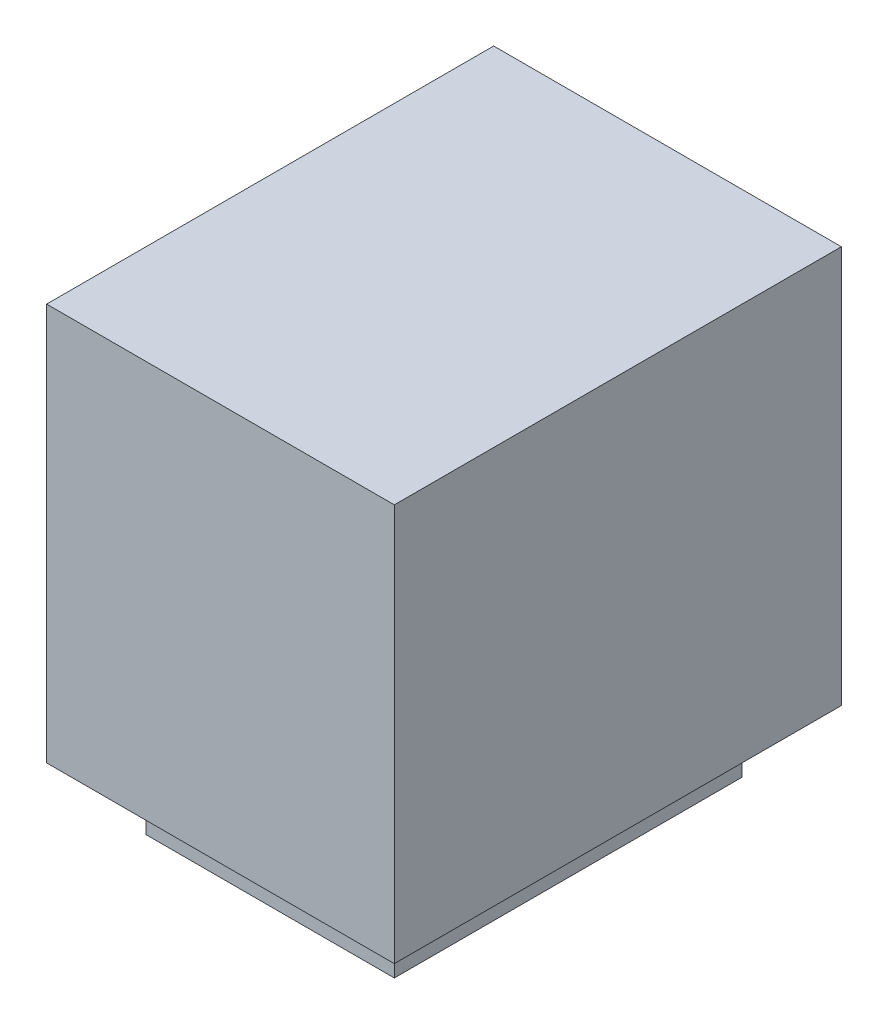
ISO-10303-21;
HEADER;
FILE_DESCRIPTION(('STEP AP214'),'2;1');
FILE_NAME('part.step','',(''),(''),'','','');
FILE_SCHEMA(('AUTOMOTIVE_DESIGN { 1 0 10303 214 1 1 1 1 }'));
ENDSEC;
DATA;
#1=APPLICATION_CONTEXT('core data for automotive mechanical design processes');
#2=APPLICATION_PROTOCOL_DEFINITION('international standard','automotive_design',2000,#1);
#3=PRODUCT_CONTEXT('',#1,'mechanical');
#4=PRODUCT('Part','Part','',(#3));
#5=PRODUCT_RELATED_PRODUCT_CATEGORY('part','',(#4));
#6=PRODUCT_DEFINITION_FORMATION('','',#4);
#7=PRODUCT_DEFINITION_CONTEXT('part definition',#1,'design');
#8=PRODUCT_DEFINITION('design','',#6,#7);
#9=PRODUCT_DEFINITION_SHAPE('','',#8);
#10=(LENGTH_UNIT() NAMED_UNIT(*) SI_UNIT(.MILLI.,.METRE.));
#11=(NAMED_UNIT(*) PLANE_ANGLE_UNIT() SI_UNIT($,.RADIAN.));
#12=(NAMED_UNIT(*) SI_UNIT($,.STERADIAN.) SOLID_ANGLE_UNIT());
#13=UNCERTAINTY_MEASURE_WITH_UNIT(LENGTH_MEASURE(1.E-05),#10,'distance_accuracy_value','');
#14=(GEOMETRIC_REPRESENTATION_CONTEXT(3) GLOBAL_UNCERTAINTY_ASSIGNED_CONTEXT((#13)) GLOBAL_UNIT_ASSIGNED_CONTEXT((#10,
#11,#12)) REPRESENTATION_CONTEXT('',''));
#15=CARTESIAN_POINT('',(0.,0.,0.));
#16=DIRECTION('',(0.,0.,1.));
#17=DIRECTION('',(1.,0.,0.));
#18=AXIS2_PLACEMENT_3D('',#15,#16,#17);
#19=CARTESIAN_POINT('',(700.,1600.,-900.));
#20=DIRECTION('',(-1.,0.,0.));
#21=DIRECTION('',(0.,0.,1.));
#22=AXIS2_PLACEMENT_3D('',#19,#20,#21);
#23=PLANE('',#22);
#24=DIRECTION('',(0.,0.,-1.));
#25=VECTOR('',#24,1.);
#26=CARTESIAN_POINT('',(700.,0.,-900.));
#27=LINE('',#26,#25);
#28=CARTESIAN_POINT('',(700.,0.,900.));
#29=VERTEX_POINT('',#28);
#30=CARTESIAN_POINT('',(700.,0.,-900.));
#31=VERTEX_POINT('',#30);
#32=EDGE_CURVE('E241',#29,#31,#27,.T.);
#33=ORIENTED_EDGE('',*,*,#32,.T.);
#34=DIRECTION('',(0.,-1.,0.));
#35=VECTOR('',#34,1.);
#36=CARTESIAN_POINT('',(700.,1600.,-900.));
#37=LINE('',#36,#35);
#38=CARTESIAN_POINT('',(700.,1600.,-900.));
#39=VERTEX_POINT('',#38);
#40=EDGE_CURVE('E11',#39,#31,#37,.T.);
#41=ORIENTED_EDGE('',*,*,#40,.F.);
#42=DIRECTION('',(0.,0.,-1.));
#43=VECTOR('',#42,1.);
#44=CARTESIAN_POINT('',(700.,1600.,-900.));
#45=LINE('',#44,#43);
#46=CARTESIAN_POINT('',(700.,1600.,900.));
#47=VERTEX_POINT('',#46);
#48=EDGE_CURVE('E247',#47,#39,#45,.T.);
#49=ORIENTED_EDGE('',*,*,#48,.F.);
#50=DIRECTION('',(0.,-1.,0.));
#51=VECTOR('',#50,1.);
#52=CARTESIAN_POINT('',(700.,1600.,900.));
#53=LINE('',#52,#51);
#54=EDGE_CURVE('E257',#47,#29,#53,.T.);
#55=ORIENTED_EDGE('',*,*,#54,.T.);
#56=EDGE_LOOP('',(#33,#41,#49,#55));
#57=FACE_BOUND('',#56,.T.);
#58=ADVANCED_FACE('F34',(#57),#23,.F.);
#59=CARTESIAN_POINT('',(-700.,1600.,-900.));
#60=DIRECTION('',(0.,0.,1.));
#61=DIRECTION('',(1.,0.,0.));
#62=AXIS2_PLACEMENT_3D('',#59,#60,#61);
#63=PLANE('',#62);
#64=DIRECTION('',(-1.,0.,0.));
#65=VECTOR('',#64,1.);
#66=CARTESIAN_POINT('',(-700.,0.,-900.));
#67=LINE('',#66,#65);
#68=CARTESIAN_POINT('',(-700.,0.,-900.));
#69=VERTEX_POINT('',#68);
#70=EDGE_CURVE('E260',#31,#69,#67,.T.);
#71=ORIENTED_EDGE('',*,*,#70,.T.);
#72=DIRECTION('',(0.,-1.,0.));
#73=VECTOR('',#72,1.);
#74=CARTESIAN_POINT('',(-700.,1600.,-900.));
#75=LINE('',#74,#73);
#76=CARTESIAN_POINT('',(-700.,1600.,-900.));
#77=VERTEX_POINT('',#76);
#78=EDGE_CURVE('E41',#77,#69,#75,.T.);
#79=ORIENTED_EDGE('',*,*,#78,.F.);
#80=DIRECTION('',(-1.,0.,0.));
#81=VECTOR('',#80,1.);
#82=CARTESIAN_POINT('',(-700.,1600.,-900.));
#83=LINE('',#82,#81);
#84=EDGE_CURVE('E250',#39,#77,#83,.T.);
#85=ORIENTED_EDGE('',*,*,#84,.F.);
#86=ORIENTED_EDGE('',*,*,#40,.T.);
#87=EDGE_LOOP('',(#71,#79,#85,#86));
#88=FACE_BOUND('',#87,.T.);
#89=ADVANCED_FACE('F290',(#88),#63,.F.);
#90=CARTESIAN_POINT('',(-700.,1600.,-900.));
#91=DIRECTION('',(1.,0.,0.));
#92=DIRECTION('',(0.,0.,-1.));
#93=AXIS2_PLACEMENT_3D('',#90,#91,#92);
#94=PLANE('',#93);
#95=DIRECTION('',(0.,0.,1.));
#96=VECTOR('',#95,1.);
#97=CARTESIAN_POINT('',(-700.,0.,-900.));
#98=LINE('',#97,#96);
#99=CARTESIAN_POINT('',(-700.,0.,900.));
#100=VERTEX_POINT('',#99);
#101=EDGE_CURVE('E262',#69,#100,#98,.T.);
#102=ORIENTED_EDGE('',*,*,#101,.T.);
#103=DIRECTION('',(0.,-1.,0.));
#104=VECTOR('',#103,1.);
#105=CARTESIAN_POINT('',(-700.,1600.,900.));
#106=LINE('',#105,#104);
#107=CARTESIAN_POINT('',(-700.,1600.,900.));
#108=VERTEX_POINT('',#107);
#109=EDGE_CURVE('E267',#108,#100,#106,.T.);
#110=ORIENTED_EDGE('',*,*,#109,.F.);
#111=DIRECTION('',(0.,0.,1.));
#112=VECTOR('',#111,1.);
#113=CARTESIAN_POINT('',(-700.,1600.,-900.));
#114=LINE('',#113,#112);
#115=EDGE_CURVE('E253',#77,#108,#114,.T.);
#116=ORIENTED_EDGE('',*,*,#115,.F.);
#117=ORIENTED_EDGE('',*,*,#78,.T.);
#118=EDGE_LOOP('',(#102,#110,#116,#117));
#119=FACE_BOUND('',#118,.T.);
#120=ADVANCED_FACE('F274',(#119),#94,.F.);
#121=CARTESIAN_POINT('',(-700.,1600.,900.));
#122=DIRECTION('',(0.,0.,-1.));
#123=DIRECTION('',(-1.,0.,0.));
#124=AXIS2_PLACEMENT_3D('',#121,#122,#123);
#125=PLANE('',#124);
#126=DIRECTION('',(1.,0.,0.));
#127=VECTOR('',#126,1.);
#128=CARTESIAN_POINT('',(-700.,0.,900.));
#129=LINE('',#128,#127);
#130=EDGE_CURVE('E251',#100,#29,#129,.T.);
#131=ORIENTED_EDGE('',*,*,#130,.T.);
#132=ORIENTED_EDGE('',*,*,#54,.F.);
#133=DIRECTION('',(1.,0.,0.));
#134=VECTOR('',#133,1.);
#135=CARTESIAN_POINT('',(-700.,1600.,900.));
#136=LINE('',#135,#134);
#137=EDGE_CURVE('E255',#108,#47,#136,.T.);
#138=ORIENTED_EDGE('',*,*,#137,.F.);
#139=ORIENTED_EDGE('',*,*,#109,.T.);
#140=EDGE_LOOP('',(#131,#132,#138,#139));
#141=FACE_BOUND('',#140,.T.);
#142=ADVANCED_FACE('F283',(#141),#125,.F.);
#143=CARTESIAN_POINT('',(0.,1600.,0.));
#144=DIRECTION('',(0.,1.,0.));
#145=DIRECTION('',(0.,0.,1.));
#146=AXIS2_PLACEMENT_3D('',#143,#144,#145);
#147=PLANE('',#146);
#148=ORIENTED_EDGE('',*,*,#48,.T.);
#149=ORIENTED_EDGE('',*,*,#84,.T.);
#150=ORIENTED_EDGE('',*,*,#115,.T.);
#151=ORIENTED_EDGE('',*,*,#137,.T.);
#152=EDGE_LOOP('',(#148,#149,#150,#151));
#153=FACE_BOUND('',#152,.T.);
#154=ADVANCED_FACE('F289',(#153),#147,.T.);
#155=CARTESIAN_POINT('',(0.,0.,0.));
#156=DIRECTION('',(0.,1.,0.));
#157=DIRECTION('',(0.,0.,1.));
#158=AXIS2_PLACEMENT_3D('',#155,#156,#157);
#159=PLANE('',#158);
#160=DIRECTION('',(1.,0.,0.));
#161=VECTOR('',#160,1.);
#162=CARTESIAN_POINT('',(-500.,0.,700.));
#163=LINE('',#162,#161);
#164=CARTESIAN_POINT('',(-500.,0.,700.));
#165=VERTEX_POINT('',#164);
#166=CARTESIAN_POINT('',(500.,0.,700.));
#167=VERTEX_POINT('',#166);
#168=EDGE_CURVE('E218',#165,#167,#163,.T.);
#169=ORIENTED_EDGE('',*,*,#168,.T.);
#170=DIRECTION('',(0.,0.,-1.));
#171=VECTOR('',#170,1.);
#172=CARTESIAN_POINT('',(500.,0.,-700.));
#173=LINE('',#172,#171);
#174=CARTESIAN_POINT('',(500.,0.,-700.));
#175=VERTEX_POINT('',#174);
#176=EDGE_CURVE('E208',#167,#175,#173,.T.);
#177=ORIENTED_EDGE('',*,*,#176,.T.);
#178=DIRECTION('',(-1.,0.,0.));
#179=VECTOR('',#178,1.);
#180=CARTESIAN_POINT('',(-500.,0.,-700.));
#181=LINE('',#180,#179);
#182=CARTESIAN_POINT('',(-500.,0.,-700.));
#183=VERTEX_POINT('',#182);
#184=EDGE_CURVE('E230',#175,#183,#181,.T.);
#185=ORIENTED_EDGE('',*,*,#184,.T.);
#186=DIRECTION('',(0.,0.,1.));
#187=VECTOR('',#186,1.);
#188=CARTESIAN_POINT('',(-500.,0.,-700.));
#189=LINE('',#188,#187);
#190=EDGE_CURVE('E233',#183,#165,#189,.T.);
#191=ORIENTED_EDGE('',*,*,#190,.T.);
#192=EDGE_LOOP('',(#169,#177,#185,#191));
#193=FACE_BOUND('',#192,.T.);
#194=ORIENTED_EDGE('',*,*,#32,.F.);
#195=ORIENTED_EDGE('',*,*,#130,.F.);
#196=ORIENTED_EDGE('',*,*,#101,.F.);
#197=ORIENTED_EDGE('',*,*,#70,.F.);
#198=EDGE_LOOP('',(#194,#195,#196,#197));
#199=FACE_BOUND('',#198,.T.);
#200=ADVANCED_FACE('F280',(#193,#199),#159,.F.);
#201=CARTESIAN_POINT('',(500.,-250.,-700.));
#202=DIRECTION('',(1.,0.,0.));
#203=DIRECTION('',(0.,0.,-1.));
#204=AXIS2_PLACEMENT_3D('',#201,#202,#203);
#205=PLANE('',#204);
#206=ORIENTED_EDGE('',*,*,#176,.F.);
#207=DIRECTION('',(0.,1.,0.));
#208=VECTOR('',#207,1.);
#209=CARTESIAN_POINT('',(500.,-250.,700.));
#210=LINE('',#209,#208);
#211=CARTESIAN_POINT('',(500.,-250.,700.));
#212=VERTEX_POINT('',#211);
#213=EDGE_CURVE('E238',#212,#167,#210,.T.);
#214=ORIENTED_EDGE('',*,*,#213,.F.);
#215=DIRECTION('',(0.,0.,-1.));
#216=VECTOR('',#215,1.);
#217=CARTESIAN_POINT('',(500.,-250.,-700.));
#218=LINE('',#217,#216);
#219=CARTESIAN_POINT('',(500.,-250.,-700.));
#220=VERTEX_POINT('',#219);
#221=EDGE_CURVE('E214',#212,#220,#218,.T.);
#222=ORIENTED_EDGE('',*,*,#221,.T.);
#223=DIRECTION('',(0.,1.,0.));
#224=VECTOR('',#223,1.);
#225=CARTESIAN_POINT('',(500.,-250.,-700.));
#226=LINE('',#225,#224);
#227=EDGE_CURVE('E227',#220,#175,#226,.T.);
#228=ORIENTED_EDGE('',*,*,#227,.T.);
#229=EDGE_LOOP('',(#206,#214,#222,#228));
#230=FACE_BOUND('',#229,.T.);
#231=ADVANCED_FACE('F302',(#230),#205,.T.);
#232=CARTESIAN_POINT('',(-500.,-250.,700.));
#233=DIRECTION('',(0.,0.,1.));
#234=DIRECTION('',(1.,0.,0.));
#235=AXIS2_PLACEMENT_3D('',#232,#233,#234);
#236=PLANE('',#235);
#237=ORIENTED_EDGE('',*,*,#168,.F.);
#238=DIRECTION('',(0.,1.,0.));
#239=VECTOR('',#238,1.);
#240=CARTESIAN_POINT('',(-500.,-250.,700.));
#241=LINE('',#240,#239);
#242=CARTESIAN_POINT('',(-500.,-250.,700.));
#243=VERTEX_POINT('',#242);
#244=EDGE_CURVE('E242',#243,#165,#241,.T.);
#245=ORIENTED_EDGE('',*,*,#244,.F.);
#246=DIRECTION('',(1.,0.,0.));
#247=VECTOR('',#246,1.);
#248=CARTESIAN_POINT('',(-500.,-250.,700.));
#249=LINE('',#248,#247);
#250=EDGE_CURVE('E224',#243,#212,#249,.T.);
#251=ORIENTED_EDGE('',*,*,#250,.T.);
#252=ORIENTED_EDGE('',*,*,#213,.T.);
#253=EDGE_LOOP('',(#237,#245,#251,#252));
#254=FACE_BOUND('',#253,.T.);
#255=ADVANCED_FACE('F308',(#254),#236,.T.);
#256=CARTESIAN_POINT('',(-500.,-250.,-700.));
#257=DIRECTION('',(-1.,0.,0.));
#258=DIRECTION('',(0.,0.,1.));
#259=AXIS2_PLACEMENT_3D('',#256,#257,#258);
#260=PLANE('',#259);
#261=ORIENTED_EDGE('',*,*,#190,.F.);
#262=DIRECTION('',(0.,1.,0.));
#263=VECTOR('',#262,1.);
#264=CARTESIAN_POINT('',(-500.,-250.,-700.));
#265=LINE('',#264,#263);
#266=CARTESIAN_POINT('',(-500.,-250.,-700.));
#267=VERTEX_POINT('',#266);
#268=EDGE_CURVE('E244',#267,#183,#265,.T.);
#269=ORIENTED_EDGE('',*,*,#268,.F.);
#270=DIRECTION('',(0.,0.,1.));
#271=VECTOR('',#270,1.);
#272=CARTESIAN_POINT('',(-500.,-250.,-700.));
#273=LINE('',#272,#271);
#274=EDGE_CURVE('E221',#267,#243,#273,.T.);
#275=ORIENTED_EDGE('',*,*,#274,.T.);
#276=ORIENTED_EDGE('',*,*,#244,.T.);
#277=EDGE_LOOP('',(#261,#269,#275,#276));
#278=FACE_BOUND('',#277,.T.);
#279=ADVANCED_FACE('F314',(#278),#260,.T.);
#280=CARTESIAN_POINT('',(-500.,-250.,-700.));
#281=DIRECTION('',(0.,0.,-1.));
#282=DIRECTION('',(-1.,0.,0.));
#283=AXIS2_PLACEMENT_3D('',#280,#281,#282);
#284=PLANE('',#283);
#285=ORIENTED_EDGE('',*,*,#184,.F.);
#286=ORIENTED_EDGE('',*,*,#227,.F.);
#287=DIRECTION('',(-1.,0.,0.));
#288=VECTOR('',#287,1.);
#289=CARTESIAN_POINT('',(-500.,-250.,-700.));
#290=LINE('',#289,#288);
#291=EDGE_CURVE('E217',#220,#267,#290,.T.);
#292=ORIENTED_EDGE('',*,*,#291,.T.);
#293=ORIENTED_EDGE('',*,*,#268,.T.);
#294=EDGE_LOOP('',(#285,#286,#292,#293));
#295=FACE_BOUND('',#294,.T.);
#296=ADVANCED_FACE('F310',(#295),#284,.T.);
#297=CARTESIAN_POINT('',(0.,-250.,0.));
#298=DIRECTION('',(0.,1.,0.));
#299=DIRECTION('',(0.,0.,1.));
#300=AXIS2_PLACEMENT_3D('',#297,#298,#299);
#301=PLANE('',#300);
#302=ORIENTED_EDGE('',*,*,#221,.F.);
#303=ORIENTED_EDGE('',*,*,#250,.F.);
#304=ORIENTED_EDGE('',*,*,#274,.F.);
#305=ORIENTED_EDGE('',*,*,#291,.F.);
#306=EDGE_LOOP('',(#302,#303,#304,#305));
#307=FACE_BOUND('',#306,.T.);
#308=ADVANCED_FACE('F313',(#307),#301,.F.);
#309=CLOSED_SHELL('',(#58,#89,#120,#142,#154,#200,#231,#255,#279,#296,#308));
#310=CARTESIAN_POINT('',(407.862922358659,1300.80675773854,-50.));
#311=DIRECTION('',(1.,0.,0.));
#312=DIRECTION('',(0.,0.,-1.));
#313=AXIS2_PLACEMENT_3D('',#310,#311,#312);
#314=PLANE('',#313);
#315=DIRECTION('',(0.,1.,0.));
#316=VECTOR('',#315,1.);
#317=CARTESIAN_POINT('',(407.862922358659,1300.80675773854,0.));
#318=LINE('',#317,#316);
#319=CARTESIAN_POINT('',(407.862922358659,300.806757738543,0.));
#320=VERTEX_POINT('',#319);
#321=CARTESIAN_POINT('',(407.862922358659,1300.80675773854,0.));
#322=VERTEX_POINT('',#321);
#323=EDGE_CURVE('E179',#320,#322,#318,.T.);
#324=ORIENTED_EDGE('',*,*,#323,.T.);
#325=DIRECTION('',(0.,0.,1.));
#326=VECTOR('',#325,1.);
#327=CARTESIAN_POINT('',(407.862922358659,1300.80675773854,-50.));
#328=LINE('',#327,#326);
#329=CARTESIAN_POINT('',(407.862922358659,1300.80675773854,-50.));
#330=VERTEX_POINT('',#329);
#331=EDGE_CURVE('E195',#330,#322,#328,.T.);
#332=ORIENTED_EDGE('',*,*,#331,.F.);
#333=DIRECTION('',(0.,1.,0.));
#334=VECTOR('',#333,1.);
#335=CARTESIAN_POINT('',(407.862922358659,1300.80675773854,-50.));
#336=LINE('',#335,#334);
#337=CARTESIAN_POINT('',(407.862922358659,300.806757738543,-50.));
#338=VERTEX_POINT('',#337);
#339=EDGE_CURVE('E182',#338,#330,#336,.T.);
#340=ORIENTED_EDGE('',*,*,#339,.F.);
#341=DIRECTION('',(0.,0.,1.));
#342=VECTOR('',#341,1.);
#343=CARTESIAN_POINT('',(407.862922358659,300.806757738543,-50.));
#344=LINE('',#343,#342);
#345=EDGE_CURVE('E206',#338,#320,#344,.T.);
#346=ORIENTED_EDGE('',*,*,#345,.T.);
#347=EDGE_LOOP('',(#324,#332,#340,#346));
#348=FACE_BOUND('',#347,.T.);
#349=ADVANCED_FACE('F325',(#348),#314,.F.);
#350=CARTESIAN_POINT('',(-392.137077641341,300.806757738543,-50.));
#351=DIRECTION('',(0.,-1.,0.));
#352=DIRECTION('',(0.,0.,-1.));
#353=AXIS2_PLACEMENT_3D('',#350,#351,#352);
#354=PLANE('',#353);
#355=DIRECTION('',(1.,0.,0.));
#356=VECTOR('',#355,1.);
#357=CARTESIAN_POINT('',(-392.137077641341,300.806757738543,0.));
#358=LINE('',#357,#356);
#359=CARTESIAN_POINT('',(-392.137077641341,300.806757738543,0.));
#360=VERTEX_POINT('',#359);
#361=EDGE_CURVE('E186',#360,#320,#358,.T.);
#362=ORIENTED_EDGE('',*,*,#361,.T.);
#363=ORIENTED_EDGE('',*,*,#345,.F.);
#364=DIRECTION('',(1.,0.,0.));
#365=VECTOR('',#364,1.);
#366=CARTESIAN_POINT('',(-392.137077641341,300.806757738543,-50.));
#367=LINE('',#366,#365);
#368=CARTESIAN_POINT('',(-392.137077641341,300.806757738543,-50.));
#369=VERTEX_POINT('',#368);
#370=EDGE_CURVE('E192',#369,#338,#367,.T.);
#371=ORIENTED_EDGE('',*,*,#370,.F.);
#372=DIRECTION('',(0.,0.,1.));
#373=VECTOR('',#372,1.);
#374=CARTESIAN_POINT('',(-392.137077641341,300.806757738543,-50.));
#375=LINE('',#374,#373);
#376=EDGE_CURVE('E209',#369,#360,#375,.T.);
#377=ORIENTED_EDGE('',*,*,#376,.T.);
#378=EDGE_LOOP('',(#362,#363,#371,#377));
#379=FACE_BOUND('',#378,.T.);
#380=ADVANCED_FACE('F328',(#379),#354,.F.);
#381=CARTESIAN_POINT('',(-392.137077641341,1300.80675773854,-50.));
#382=DIRECTION('',(-1.,0.,0.));
#383=DIRECTION('',(0.,0.,1.));
#384=AXIS2_PLACEMENT_3D('',#381,#382,#383);
#385=PLANE('',#384);
#386=DIRECTION('',(0.,-1.,0.));
#387=VECTOR('',#386,1.);
#388=CARTESIAN_POINT('',(-392.137077641341,1300.80675773854,0.));
#389=LINE('',#388,#387);
#390=CARTESIAN_POINT('',(-392.137077641341,1300.80675773854,0.));
#391=VERTEX_POINT('',#390);
#392=EDGE_CURVE('E201',#391,#360,#389,.T.);
#393=ORIENTED_EDGE('',*,*,#392,.T.);
#394=ORIENTED_EDGE('',*,*,#376,.F.);
#395=DIRECTION('',(0.,-1.,0.));
#396=VECTOR('',#395,1.);
#397=CARTESIAN_POINT('',(-392.137077641341,1300.80675773854,-50.));
#398=LINE('',#397,#396);
#399=CARTESIAN_POINT('',(-392.137077641341,1300.80675773854,-50.));
#400=VERTEX_POINT('',#399);
#401=EDGE_CURVE('E189',#400,#369,#398,.T.);
#402=ORIENTED_EDGE('',*,*,#401,.F.);
#403=DIRECTION('',(0.,0.,1.));
#404=VECTOR('',#403,1.);
#405=CARTESIAN_POINT('',(-392.137077641341,1300.80675773854,-50.));
#406=LINE('',#405,#404);
#407=EDGE_CURVE('E211',#400,#391,#406,.T.);
#408=ORIENTED_EDGE('',*,*,#407,.T.);
#409=EDGE_LOOP('',(#393,#394,#402,#408));
#410=FACE_BOUND('',#409,.T.);
#411=ADVANCED_FACE('F334',(#410),#385,.F.);
#412=CARTESIAN_POINT('',(-392.137077641341,1300.80675773854,-50.));
#413=DIRECTION('',(0.,1.,0.));
#414=DIRECTION('',(0.,0.,1.));
#415=AXIS2_PLACEMENT_3D('',#412,#413,#414);
#416=PLANE('',#415);
#417=DIRECTION('',(-1.,0.,0.));
#418=VECTOR('',#417,1.);
#419=CARTESIAN_POINT('',(-392.137077641341,1300.80675773854,0.));
#420=LINE('',#419,#418);
#421=EDGE_CURVE('E198',#322,#391,#420,.T.);
#422=ORIENTED_EDGE('',*,*,#421,.T.);
#423=ORIENTED_EDGE('',*,*,#407,.F.);
#424=DIRECTION('',(-1.,0.,0.));
#425=VECTOR('',#424,1.);
#426=CARTESIAN_POINT('',(-392.137077641341,1300.80675773854,-50.));
#427=LINE('',#426,#425);
#428=EDGE_CURVE('E185',#330,#400,#427,.T.);
#429=ORIENTED_EDGE('',*,*,#428,.F.);
#430=ORIENTED_EDGE('',*,*,#331,.T.);
#431=EDGE_LOOP('',(#422,#423,#429,#430));
#432=FACE_BOUND('',#431,.T.);
#433=ADVANCED_FACE('F331',(#432),#416,.F.);
#434=CARTESIAN_POINT('',(0.,0.,-50.));
#435=DIRECTION('',(0.,0.,1.));
#436=DIRECTION('',(1.,0.,0.));
#437=AXIS2_PLACEMENT_3D('',#434,#435,#436);
#438=PLANE('',#437);
#439=DIRECTION('',(0.,1.,0.));
#440=VECTOR('',#439,1.);
#441=CARTESIAN_POINT('',(273.588767075977,999.395524814519,-50.));
#442=LINE('',#441,#440);
#443=CARTESIAN_POINT('',(273.588767075977,649.39552481452,-50.));
#444=VERTEX_POINT('',#443);
#445=CARTESIAN_POINT('',(273.588767075977,999.395524814519,-50.));
#446=VERTEX_POINT('',#445);
#447=EDGE_CURVE('E48',#444,#446,#442,.T.);
#448=ORIENTED_EDGE('',*,*,#447,.F.);
#449=DIRECTION('',(1.,0.,0.));
#450=VECTOR('',#449,1.);
#451=CARTESIAN_POINT('',(-226.411232924023,649.395524814519,-50.));
#452=LINE('',#451,#450);
#453=CARTESIAN_POINT('',(-226.411232924023,649.395524814519,-50.));
#454=VERTEX_POINT('',#453);
#455=EDGE_CURVE('E53',#454,#444,#452,.T.);
#456=ORIENTED_EDGE('',*,*,#455,.F.);
#457=DIRECTION('',(0.,-1.,0.));
#458=VECTOR('',#457,1.);
#459=CARTESIAN_POINT('',(-226.411232924023,999.395524814519,-50.));
#460=LINE('',#459,#458);
#461=CARTESIAN_POINT('',(-226.411232924023,999.395524814519,-50.));
#462=VERTEX_POINT('',#461);
#463=EDGE_CURVE('E143',#462,#454,#460,.T.);
#464=ORIENTED_EDGE('',*,*,#463,.F.);
#465=DIRECTION('',(-1.,0.,0.));
#466=VECTOR('',#465,1.);
#467=CARTESIAN_POINT('',(-226.411232924023,999.395524814519,-50.));
#468=LINE('',#467,#466);
#469=EDGE_CURVE('E148',#446,#462,#468,.T.);
#470=ORIENTED_EDGE('',*,*,#469,.F.);
#471=EDGE_LOOP('',(#448,#456,#464,#470));
#472=FACE_BOUND('',#471,.T.);
#473=ORIENTED_EDGE('',*,*,#339,.T.);
#474=ORIENTED_EDGE('',*,*,#428,.T.);
#475=ORIENTED_EDGE('',*,*,#401,.T.);
#476=ORIENTED_EDGE('',*,*,#370,.T.);
#477=EDGE_LOOP('',(#473,#474,#475,#476));
#478=FACE_BOUND('',#477,.T.);
#479=ADVANCED_FACE('F145',(#472,#478),#438,.T.);
#480=CARTESIAN_POINT('',(0.,0.,0.));
#481=DIRECTION('',(0.,0.,1.));
#482=DIRECTION('',(1.,0.,0.));
#483=AXIS2_PLACEMENT_3D('',#480,#481,#482);
#484=PLANE('',#483);
#485=DIRECTION('',(1.,0.,0.));
#486=VECTOR('',#485,1.);
#487=CARTESIAN_POINT('',(-226.411232924023,649.395524814519,0.));
#488=LINE('',#487,#486);
#489=CARTESIAN_POINT('',(-226.411232924023,649.395524814519,0.));
#490=VERTEX_POINT('',#489);
#491=CARTESIAN_POINT('',(273.588767075977,649.39552481452,0.));
#492=VERTEX_POINT('',#491);
#493=EDGE_CURVE('E165',#490,#492,#488,.T.);
#494=ORIENTED_EDGE('',*,*,#493,.T.);
#495=DIRECTION('',(0.,1.,0.));
#496=VECTOR('',#495,1.);
#497=CARTESIAN_POINT('',(273.588767075977,999.395524814519,0.));
#498=LINE('',#497,#496);
#499=CARTESIAN_POINT('',(273.588767075977,999.395524814519,0.));
#500=VERTEX_POINT('',#499);
#501=EDGE_CURVE('E169',#492,#500,#498,.T.);
#502=ORIENTED_EDGE('',*,*,#501,.T.);
#503=DIRECTION('',(-1.,0.,0.));
#504=VECTOR('',#503,1.);
#505=CARTESIAN_POINT('',(-226.411232924023,999.395524814519,0.));
#506=LINE('',#505,#504);
#507=CARTESIAN_POINT('',(-226.411232924023,999.395524814519,0.));
#508=VERTEX_POINT('',#507);
#509=EDGE_CURVE('E172',#500,#508,#506,.T.);
#510=ORIENTED_EDGE('',*,*,#509,.T.);
#511=DIRECTION('',(0.,-1.,0.));
#512=VECTOR('',#511,1.);
#513=CARTESIAN_POINT('',(-226.411232924023,999.395524814519,0.));
#514=LINE('',#513,#512);
#515=EDGE_CURVE('E156',#508,#490,#514,.T.);
#516=ORIENTED_EDGE('',*,*,#515,.T.);
#517=EDGE_LOOP('',(#494,#502,#510,#516));
#518=FACE_BOUND('',#517,.T.);
#519=ORIENTED_EDGE('',*,*,#323,.F.);
#520=ORIENTED_EDGE('',*,*,#361,.F.);
#521=ORIENTED_EDGE('',*,*,#392,.F.);
#522=ORIENTED_EDGE('',*,*,#421,.F.);
#523=EDGE_LOOP('',(#519,#520,#521,#522));
#524=FACE_BOUND('',#523,.T.);
#525=ADVANCED_FACE('F342',(#518,#524),#484,.F.);
#526=CARTESIAN_POINT('',(273.588767075977,999.395524814519,-50.));
#527=DIRECTION('',(1.,0.,0.));
#528=DIRECTION('',(0.,0.,-1.));
#529=AXIS2_PLACEMENT_3D('',#526,#527,#528);
#530=PLANE('',#529);
#531=ORIENTED_EDGE('',*,*,#501,.F.);
#532=DIRECTION('',(0.,0.,1.));
#533=VECTOR('',#532,1.);
#534=CARTESIAN_POINT('',(273.588767075977,649.39552481452,-50.));
#535=LINE('',#534,#533);
#536=EDGE_CURVE('E177',#444,#492,#535,.T.);
#537=ORIENTED_EDGE('',*,*,#536,.F.);
#538=ORIENTED_EDGE('',*,*,#447,.T.);
#539=DIRECTION('',(0.,0.,1.));
#540=VECTOR('',#539,1.);
#541=CARTESIAN_POINT('',(273.588767075977,999.395524814519,-50.));
#542=LINE('',#541,#540);
#543=EDGE_CURVE('E161',#446,#500,#542,.T.);
#544=ORIENTED_EDGE('',*,*,#543,.T.);
#545=EDGE_LOOP('',(#531,#537,#538,#544));
#546=FACE_BOUND('',#545,.T.);
#547=ADVANCED_FACE('F345',(#546),#530,.T.);
#548=CARTESIAN_POINT('',(-226.411232924023,649.395524814519,-50.));
#549=DIRECTION('',(0.,-1.,0.));
#550=DIRECTION('',(1.,0.,0.));
#551=AXIS2_PLACEMENT_3D('',#548,#549,#550);
#552=PLANE('',#551);
#553=ORIENTED_EDGE('',*,*,#493,.F.);
#554=DIRECTION('',(0.,0.,1.));
#555=VECTOR('',#554,1.);
#556=CARTESIAN_POINT('',(-226.411232924023,649.395524814519,-50.));
#557=LINE('',#556,#555);
#558=EDGE_CURVE('E160',#454,#490,#557,.T.);
#559=ORIENTED_EDGE('',*,*,#558,.F.);
#560=ORIENTED_EDGE('',*,*,#455,.T.);
#561=ORIENTED_EDGE('',*,*,#536,.T.);
#562=EDGE_LOOP('',(#553,#559,#560,#561));
#563=FACE_BOUND('',#562,.T.);
#564=ADVANCED_FACE('F351',(#563),#552,.T.);
#565=CARTESIAN_POINT('',(-226.411232924023,999.395524814519,-50.));
#566=DIRECTION('',(-1.,0.,0.));
#567=DIRECTION('',(0.,0.,1.));
#568=AXIS2_PLACEMENT_3D('',#565,#566,#567);
#569=PLANE('',#568);
#570=ORIENTED_EDGE('',*,*,#515,.F.);
#571=DIRECTION('',(0.,0.,1.));
#572=VECTOR('',#571,1.);
#573=CARTESIAN_POINT('',(-226.411232924023,999.395524814519,-50.));
#574=LINE('',#573,#572);
#575=EDGE_CURVE('E153',#462,#508,#574,.T.);
#576=ORIENTED_EDGE('',*,*,#575,.F.);
#577=ORIENTED_EDGE('',*,*,#463,.T.);
#578=ORIENTED_EDGE('',*,*,#558,.T.);
#579=EDGE_LOOP('',(#570,#576,#577,#578));
#580=FACE_BOUND('',#579,.T.);
#581=ADVANCED_FACE('F154',(#580),#569,.T.);
#582=CARTESIAN_POINT('',(-226.411232924023,999.395524814519,-50.));
#583=DIRECTION('',(0.,1.,0.));
#584=DIRECTION('',(0.,0.,1.));
#585=AXIS2_PLACEMENT_3D('',#582,#583,#584);
#586=PLANE('',#585);
#587=ORIENTED_EDGE('',*,*,#509,.F.);
#588=ORIENTED_EDGE('',*,*,#543,.F.);
#589=ORIENTED_EDGE('',*,*,#469,.T.);
#590=ORIENTED_EDGE('',*,*,#575,.T.);
#591=EDGE_LOOP('',(#587,#588,#589,#590));
#592=FACE_BOUND('',#591,.T.);
#593=ADVANCED_FACE('F163',(#592),#586,.T.);
#594=CLOSED_SHELL('',(#349,#380,#411,#433,#479,#525,#547,#564,#581,#593));
#595=ORIENTED_CLOSED_SHELL('',*,#594,.T.);
#596=BREP_WITH_VOIDS('B2',#309,(#595));
#597=ADVANCED_BREP_SHAPE_REPRESENTATION('',(#18,#596),#14);
#598=SHAPE_DEFINITION_REPRESENTATION(#9,#597);
ENDSEC;
END-ISO-10303-21;
